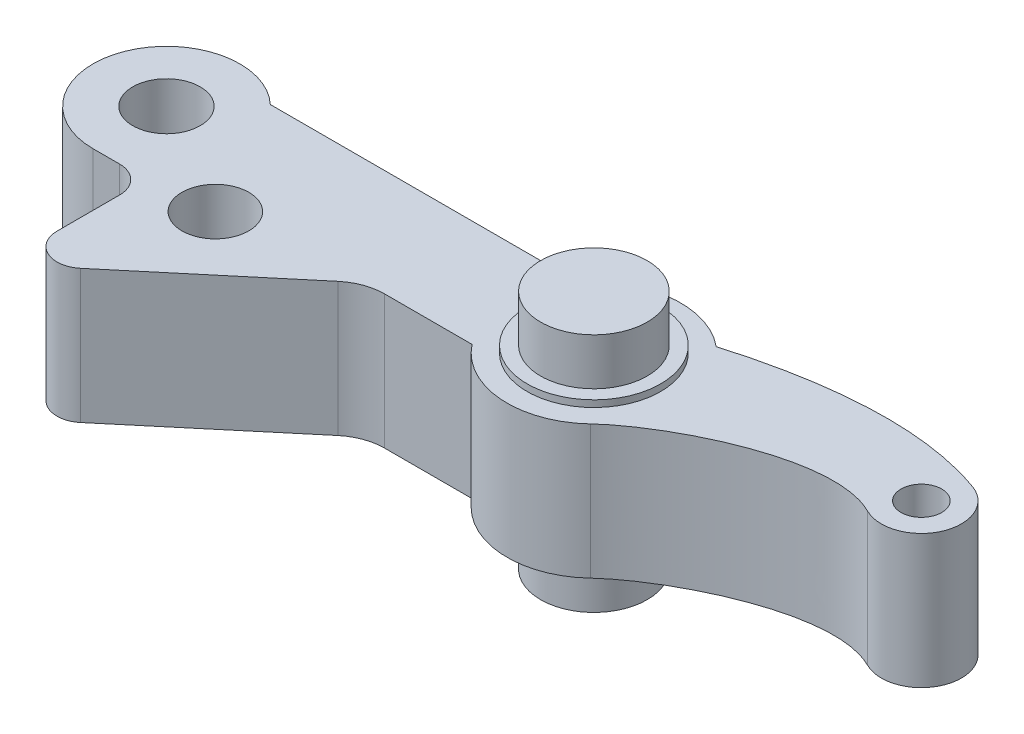
ISO-10303-21;
HEADER;
FILE_DESCRIPTION(('STEP AP214'),'2;1');
FILE_NAME('part.step','',(''),(''),'','','');
FILE_SCHEMA(('AUTOMOTIVE_DESIGN { 1 0 10303 214 1 1 1 1 }'));
ENDSEC;
DATA;
#1=APPLICATION_CONTEXT('core data for automotive mechanical design processes');
#2=APPLICATION_PROTOCOL_DEFINITION('international standard','automotive_design',2000,#1);
#3=PRODUCT_CONTEXT('',#1,'mechanical');
#4=PRODUCT('Part','Part','',(#3));
#5=PRODUCT_RELATED_PRODUCT_CATEGORY('part','',(#4));
#6=PRODUCT_DEFINITION_FORMATION('','',#4);
#7=PRODUCT_DEFINITION_CONTEXT('part definition',#1,'design');
#8=PRODUCT_DEFINITION('design','',#6,#7);
#9=PRODUCT_DEFINITION_SHAPE('','',#8);
#10=(LENGTH_UNIT() NAMED_UNIT(*) SI_UNIT(.MILLI.,.METRE.));
#11=(NAMED_UNIT(*) PLANE_ANGLE_UNIT() SI_UNIT($,.RADIAN.));
#12=(NAMED_UNIT(*) SI_UNIT($,.STERADIAN.) SOLID_ANGLE_UNIT());
#13=UNCERTAINTY_MEASURE_WITH_UNIT(LENGTH_MEASURE(1.E-05),#10,'distance_accuracy_value','');
#14=(GEOMETRIC_REPRESENTATION_CONTEXT(3) GLOBAL_UNCERTAINTY_ASSIGNED_CONTEXT((#13)) GLOBAL_UNIT_ASSIGNED_CONTEXT((#10,
#11,#12)) REPRESENTATION_CONTEXT('',''));
#15=CARTESIAN_POINT('',(0.,0.,0.));
#16=DIRECTION('',(0.,0.,1.));
#17=DIRECTION('',(1.,0.,0.));
#18=AXIS2_PLACEMENT_3D('',#15,#16,#17);
#19=CARTESIAN_POINT('',(0.,10.,0.));
#20=DIRECTION('',(0.,-1.,0.));
#21=DIRECTION('',(0.,0.,1.));
#22=AXIS2_PLACEMENT_3D('',#19,#20,#21);
#23=CYLINDRICAL_SURFACE('',#22,6.5);
#24=DIRECTION('',(0.,-1.,0.));
#25=VECTOR('',#24,1.);
#26=CARTESIAN_POINT('',(4.15942052119721,10.,-4.9949195116483));
#27=LINE('',#26,#25);
#28=CARTESIAN_POINT('',(4.15942052119714,10.,-4.99491951164822));
#29=VERTEX_POINT('',#28);
#30=CARTESIAN_POINT('',(4.15942052119714,0.,-4.99491951164822));
#31=VERTEX_POINT('',#30);
#32=EDGE_CURVE('E268',#29,#31,#27,.T.);
#33=ORIENTED_EDGE('',*,*,#32,.T.);
#34=CARTESIAN_POINT('',(0.,0.,0.));
#35=DIRECTION('',(0.,-1.,0.));
#36=DIRECTION('',(0.,0.,-1.));
#37=AXIS2_PLACEMENT_3D('',#34,#35,#36);
#38=CIRCLE('',#37,6.5);
#39=CARTESIAN_POINT('',(-5.1234753829798,0.,-4.));
#40=VERTEX_POINT('',#39);
#41=EDGE_CURVE('E271',#40,#31,#38,.T.);
#42=ORIENTED_EDGE('',*,*,#41,.F.);
#43=DIRECTION('',(0.,-1.,0.));
#44=VECTOR('',#43,1.);
#45=CARTESIAN_POINT('',(-5.1234753829798,10.,-4.));
#46=LINE('',#45,#44);
#47=CARTESIAN_POINT('',(-5.1234753829798,10.,-4.));
#48=VERTEX_POINT('',#47);
#49=EDGE_CURVE('E328',#48,#40,#46,.T.);
#50=ORIENTED_EDGE('',*,*,#49,.F.);
#51=CARTESIAN_POINT('',(0.,10.,0.));
#52=DIRECTION('',(0.,-1.,0.));
#53=DIRECTION('',(0.,0.,-1.));
#54=AXIS2_PLACEMENT_3D('',#51,#52,#53);
#55=CIRCLE('',#54,6.5);
#56=EDGE_CURVE('E273',#48,#29,#55,.T.);
#57=ORIENTED_EDGE('',*,*,#56,.T.);
#58=EDGE_LOOP('',(#33,#42,#50,#57));
#59=FACE_BOUND('',#58,.T.);
#60=ADVANCED_FACE('F49',(#59),#23,.T.);
#61=CARTESIAN_POINT('',(0.,10.,0.));
#62=DIRECTION('',(0.,1.,0.));
#63=DIRECTION('',(0.,0.,-1.));
#64=AXIS2_PLACEMENT_3D('',#61,#62,#63);
#65=PLANE('',#64);
#66=CARTESIAN_POINT('',(0.,10.,0.));
#67=DIRECTION('',(0.,-1.,0.));
#68=DIRECTION('',(0.,0.,-1.));
#69=AXIS2_PLACEMENT_3D('',#66,#67,#68);
#70=CIRCLE('',#69,5.);
#71=CARTESIAN_POINT('',(0.,10.,-5.));
#72=VERTEX_POINT('',#71);
#73=EDGE_CURVE('E409',#72,#72,#70,.T.);
#74=ORIENTED_EDGE('',*,*,#73,.T.);
#75=EDGE_LOOP('',(#74));
#76=FACE_BOUND('',#75,.T.);
#77=CARTESIAN_POINT('',(-32.,10.,0.));
#78=DIRECTION('',(0.,-1.,0.));
#79=DIRECTION('',(0.,0.,-1.));
#80=AXIS2_PLACEMENT_3D('',#77,#78,#79);
#81=CIRCLE('',#80,2.525);
#82=CARTESIAN_POINT('',(-32.,10.,-2.525));
#83=VERTEX_POINT('',#82);
#84=EDGE_CURVE('E297',#83,#83,#81,.T.);
#85=ORIENTED_EDGE('',*,*,#84,.T.);
#86=EDGE_LOOP('',(#85));
#87=FACE_BOUND('',#86,.T.);
#88=DIRECTION('',(-0.766044443118977,0.,0.64278760968654));
#89=VECTOR('',#88,1.);
#90=CARTESIAN_POINT('',(-13.1234753829798,10.,4.));
#91=LINE('',#90,#89);
#92=CARTESIAN_POINT('',(-14.2387448846612,10.,4.93582222752409));
#93=VERTEX_POINT('',#92);
#94=CARTESIAN_POINT('',(-24.7144247806269,10.,13.7259613645602));
#95=VERTEX_POINT('',#94);
#96=EDGE_CURVE('E310',#93,#95,#91,.T.);
#97=ORIENTED_EDGE('',*,*,#96,.F.);
#98=CARTESIAN_POINT('',(-11.667594445915,10.,8.));
#99=DIRECTION('',(0.,-1.,0.));
#100=DIRECTION('',(0.,0.,-1.));
#101=AXIS2_PLACEMENT_3D('',#98,#99,#100);
#102=CIRCLE('',#101,4.);
#103=CARTESIAN_POINT('',(-11.667594445915,10.,4.));
#104=VERTEX_POINT('',#103);
#105=EDGE_CURVE('E374',#104,#93,#102,.F.);
#106=ORIENTED_EDGE('',*,*,#105,.F.);
#107=DIRECTION('',(-1.,0.,0.));
#108=VECTOR('',#107,1.);
#109=CARTESIAN_POINT('',(-5.1234753829798,10.,4.));
#110=LINE('',#109,#108);
#111=CARTESIAN_POINT('',(-5.1234753829798,10.,4.));
#112=VERTEX_POINT('',#111);
#113=EDGE_CURVE('E306',#112,#104,#110,.T.);
#114=ORIENTED_EDGE('',*,*,#113,.F.);
#115=CARTESIAN_POINT('',(4.46665949633729,10.,4.72217671670385));
#116=VERTEX_POINT('',#115);
#117=EDGE_CURVE('E179',#116,#112,#55,.T.);
#118=ORIENTED_EDGE('',*,*,#117,.F.);
#119=CARTESIAN_POINT('',(4.46665949633744,10.,4.722176716704));
#120=CARTESIAN_POINT('',(7.28486409440791,10.,2.05646531160841));
#121=CARTESIAN_POINT('',(15.7167376008388,10.,-2.39624755191802));
#122=CARTESIAN_POINT('',(20.4900711475221,10.,0.));
#123=B_SPLINE_CURVE_WITH_KNOTS('',3,(#119,#120,#121,#122),.UNSPECIFIED.,.F.,.F.,(4,4),(0.,1.),.UNSPECIFIED.);
#124=CARTESIAN_POINT('',(20.4900711475221,10.,0.));
#125=VERTEX_POINT('',#124);
#126=EDGE_CURVE('E155',#116,#125,#123,.T.);
#127=ORIENTED_EDGE('',*,*,#126,.T.);
#128=CARTESIAN_POINT('',(21.8360153361091,10.,-2.68112555491325));
#129=DIRECTION('',(0.,1.,0.));
#130=DIRECTION('',(0.,0.,1.));
#131=AXIS2_PLACEMENT_3D('',#128,#129,#130);
#132=CIRCLE('',#131,3.);
#133=CARTESIAN_POINT('',(22.8496559981527,10.,-5.50469290991856));
#134=VERTEX_POINT('',#133);
#135=EDGE_CURVE('E167',#134,#125,#132,.F.);
#136=ORIENTED_EDGE('',*,*,#135,.F.);
#137=CARTESIAN_POINT('',(4.15942052119714,10.,-4.99491951164822));
#138=CARTESIAN_POINT('',(15.250954870233,10.,-8.23257274190577));
#139=CARTESIAN_POINT('',(22.8496559981527,10.,-5.50469290991856));
#140=B_SPLINE_CURVE_WITH_KNOTS('',2,(#137,#138,#139),.UNSPECIFIED.,.F.,.F.,(3,3),(0.,1.),.UNSPECIFIED.);
#141=EDGE_CURVE('E172',#29,#134,#140,.T.);
#142=ORIENTED_EDGE('',*,*,#141,.F.);
#143=ORIENTED_EDGE('',*,*,#56,.F.);
#144=DIRECTION('',(1.,0.,0.));
#145=VECTOR('',#144,1.);
#146=CARTESIAN_POINT('',(-5.1234753829798,10.,-4.));
#147=LINE('',#146,#145);
#148=CARTESIAN_POINT('',(-28.2250827823646,10.,-4.));
#149=VERTEX_POINT('',#148);
#150=EDGE_CURVE('E325',#149,#48,#147,.T.);
#151=ORIENTED_EDGE('',*,*,#150,.F.);
#152=CARTESIAN_POINT('',(-32.,10.,0.));
#153=DIRECTION('',(0.,-1.,0.));
#154=DIRECTION('',(0.,0.,-1.));
#155=AXIS2_PLACEMENT_3D('',#152,#153,#154);
#156=CIRCLE('',#155,5.5);
#157=CARTESIAN_POINT('',(-32.,10.,5.5));
#158=VERTEX_POINT('',#157);
#159=EDGE_CURVE('E321',#158,#149,#156,.T.);
#160=ORIENTED_EDGE('',*,*,#159,.F.);
#161=DIRECTION('',(-1.,0.,0.));
#162=VECTOR('',#161,1.);
#163=CARTESIAN_POINT('',(-32.,10.,5.5));
#164=LINE('',#163,#162);
#165=CARTESIAN_POINT('',(-30.,10.,5.5));
#166=VERTEX_POINT('',#165);
#167=EDGE_CURVE('E317',#166,#158,#164,.T.);
#168=ORIENTED_EDGE('',*,*,#167,.F.);
#169=CARTESIAN_POINT('',(-30.,10.,7.5));
#170=DIRECTION('',(0.,-1.,0.));
#171=DIRECTION('',(0.,0.,-1.));
#172=AXIS2_PLACEMENT_3D('',#169,#170,#171);
#173=CIRCLE('',#172,2.);
#174=CARTESIAN_POINT('',(-28.,10.,7.5));
#175=VERTEX_POINT('',#174);
#176=EDGE_CURVE('E11',#175,#166,#173,.F.);
#177=ORIENTED_EDGE('',*,*,#176,.F.);
#178=DIRECTION('',(0.,0.,-1.));
#179=VECTOR('',#178,1.);
#180=CARTESIAN_POINT('',(-28.,10.,16.4828863193414));
#181=LINE('',#180,#179);
#182=CARTESIAN_POINT('',(-28.,10.,12.1938724783223));
#183=VERTEX_POINT('',#182);
#184=EDGE_CURVE('E314',#183,#175,#181,.T.);
#185=ORIENTED_EDGE('',*,*,#184,.F.);
#186=CARTESIAN_POINT('',(-26.,10.,12.1938724783223));
#187=DIRECTION('',(0.,-1.,0.));
#188=DIRECTION('',(0.,0.,-1.));
#189=AXIS2_PLACEMENT_3D('',#186,#187,#188);
#190=CIRCLE('',#189,2.);
#191=EDGE_CURVE('E388',#95,#183,#190,.T.);
#192=ORIENTED_EDGE('',*,*,#191,.F.);
#193=EDGE_LOOP('',(#97,#106,#114,#118,#127,#136,#142,#143,#151,#160,#168,#177,#185,#192));
#194=FACE_BOUND('',#193,.T.);
#195=CARTESIAN_POINT('',(-23.3397459621556,10.,5.00000000000001));
#196=DIRECTION('',(0.,-1.,0.));
#197=DIRECTION('',(0.,0.,-1.));
#198=AXIS2_PLACEMENT_3D('',#195,#196,#197);
#199=CIRCLE('',#198,2.505);
#200=CARTESIAN_POINT('',(-23.3397459621556,10.,2.49500000000001));
#201=VERTEX_POINT('',#200);
#202=EDGE_CURVE('E282',#201,#201,#199,.T.);
#203=ORIENTED_EDGE('',*,*,#202,.T.);
#204=EDGE_LOOP('',(#203));
#205=FACE_BOUND('',#204,.T.);
#206=CARTESIAN_POINT('',(21.8360153361091,10.,-2.68112555491325));
#207=DIRECTION('',(0.,1.,0.));
#208=DIRECTION('',(0.,0.,1.));
#209=AXIS2_PLACEMENT_3D('',#206,#207,#208);
#210=CIRCLE('',#209,1.525);
#211=CARTESIAN_POINT('',(21.8360153361091,10.,-1.15612555491325));
#212=VERTEX_POINT('',#211);
#213=EDGE_CURVE('E181',#212,#212,#210,.F.);
#214=ORIENTED_EDGE('',*,*,#213,.T.);
#215=EDGE_LOOP('',(#214));
#216=FACE_BOUND('',#215,.T.);
#217=ADVANCED_FACE('F175',(#76,#87,#194,#205,#216),#65,.T.);
#218=CARTESIAN_POINT('',(0.,0.,0.));
#219=DIRECTION('',(0.,1.,0.));
#220=DIRECTION('',(0.,0.,-1.));
#221=AXIS2_PLACEMENT_3D('',#218,#219,#220);
#222=PLANE('',#221);
#223=CARTESIAN_POINT('',(0.,0.,0.));
#224=DIRECTION('',(0.,-1.,0.));
#225=DIRECTION('',(0.,0.,-1.));
#226=AXIS2_PLACEMENT_3D('',#223,#224,#225);
#227=CIRCLE('',#226,5.);
#228=CARTESIAN_POINT('',(0.,0.,-5.));
#229=VERTEX_POINT('',#228);
#230=EDGE_CURVE('E418',#229,#229,#227,.T.);
#231=ORIENTED_EDGE('',*,*,#230,.F.);
#232=EDGE_LOOP('',(#231));
#233=FACE_BOUND('',#232,.T.);
#234=DIRECTION('',(0.,0.,-1.));
#235=VECTOR('',#234,1.);
#236=CARTESIAN_POINT('',(-28.,0.,16.4828863193414));
#237=LINE('',#236,#235);
#238=CARTESIAN_POINT('',(-28.,0.,12.1938724783223));
#239=VERTEX_POINT('',#238);
#240=CARTESIAN_POINT('',(-28.,0.,7.5));
#241=VERTEX_POINT('',#240);
#242=EDGE_CURVE('E339',#239,#241,#237,.T.);
#243=ORIENTED_EDGE('',*,*,#242,.T.);
#244=CARTESIAN_POINT('',(-30.,0.,7.5));
#245=DIRECTION('',(0.,-1.,0.));
#246=DIRECTION('',(0.,0.,-1.));
#247=AXIS2_PLACEMENT_3D('',#244,#245,#246);
#248=CIRCLE('',#247,2.);
#249=CARTESIAN_POINT('',(-30.,0.,5.5));
#250=VERTEX_POINT('',#249);
#251=EDGE_CURVE('E59',#250,#241,#248,.T.);
#252=ORIENTED_EDGE('',*,*,#251,.F.);
#253=DIRECTION('',(-1.,0.,0.));
#254=VECTOR('',#253,1.);
#255=CARTESIAN_POINT('',(-32.,0.,5.5));
#256=LINE('',#255,#254);
#257=CARTESIAN_POINT('',(-32.,0.,5.5));
#258=VERTEX_POINT('',#257);
#259=EDGE_CURVE('E343',#250,#258,#256,.T.);
#260=ORIENTED_EDGE('',*,*,#259,.T.);
#261=CARTESIAN_POINT('',(-32.,0.,0.));
#262=DIRECTION('',(0.,-1.,0.));
#263=DIRECTION('',(0.,0.,-1.));
#264=AXIS2_PLACEMENT_3D('',#261,#262,#263);
#265=CIRCLE('',#264,5.5);
#266=CARTESIAN_POINT('',(-28.2250827823646,0.,-4.));
#267=VERTEX_POINT('',#266);
#268=EDGE_CURVE('E347',#258,#267,#265,.T.);
#269=ORIENTED_EDGE('',*,*,#268,.T.);
#270=DIRECTION('',(1.,0.,0.));
#271=VECTOR('',#270,1.);
#272=CARTESIAN_POINT('',(-5.1234753829798,0.,-4.));
#273=LINE('',#272,#271);
#274=EDGE_CURVE('E350',#267,#40,#273,.T.);
#275=ORIENTED_EDGE('',*,*,#274,.T.);
#276=ORIENTED_EDGE('',*,*,#41,.T.);
#277=CARTESIAN_POINT('',(4.15942052119714,0.,-4.99491951164822));
#278=CARTESIAN_POINT('',(15.250954870233,0.,-8.23257274190577));
#279=CARTESIAN_POINT('',(22.8496559981527,0.,-5.50469290991856));
#280=B_SPLINE_CURVE_WITH_KNOTS('',2,(#277,#278,#279),.UNSPECIFIED.,.F.,.F.,(3,3),(0.,1.),.UNSPECIFIED.);
#281=CARTESIAN_POINT('',(22.8496559981527,0.,-5.50469290991856));
#282=VERTEX_POINT('',#281);
#283=EDGE_CURVE('E187',#31,#282,#280,.T.);
#284=ORIENTED_EDGE('',*,*,#283,.T.);
#285=CARTESIAN_POINT('',(21.8360153361091,0.,-2.68112555491325));
#286=DIRECTION('',(0.,1.,0.));
#287=DIRECTION('',(0.,0.,1.));
#288=AXIS2_PLACEMENT_3D('',#285,#286,#287);
#289=CIRCLE('',#288,3.);
#290=CARTESIAN_POINT('',(20.4900711475221,0.,0.));
#291=VERTEX_POINT('',#290);
#292=EDGE_CURVE('E432',#282,#291,#289,.F.);
#293=ORIENTED_EDGE('',*,*,#292,.T.);
#294=CARTESIAN_POINT('',(4.46665949633744,0.,4.722176716704));
#295=CARTESIAN_POINT('',(7.28486409440791,0.,2.05646531160841));
#296=CARTESIAN_POINT('',(15.7167376008388,0.,-2.39624755191802));
#297=CARTESIAN_POINT('',(20.4900711475221,0.,0.));
#298=B_SPLINE_CURVE_WITH_KNOTS('',3,(#294,#295,#296,#297),.UNSPECIFIED.,.F.,.F.,(4,4),(0.,1.),.UNSPECIFIED.);
#299=CARTESIAN_POINT('',(4.46665949633736,0.,4.72217671670392));
#300=VERTEX_POINT('',#299);
#301=EDGE_CURVE('E158',#300,#291,#298,.T.);
#302=ORIENTED_EDGE('',*,*,#301,.F.);
#303=CARTESIAN_POINT('',(-5.1234753829798,0.,4.));
#304=VERTEX_POINT('',#303);
#305=EDGE_CURVE('E301',#300,#304,#38,.T.);
#306=ORIENTED_EDGE('',*,*,#305,.T.);
#307=DIRECTION('',(-1.,0.,0.));
#308=VECTOR('',#307,1.);
#309=CARTESIAN_POINT('',(-5.1234753829798,0.,4.));
#310=LINE('',#309,#308);
#311=CARTESIAN_POINT('',(-11.667594445915,0.,4.));
#312=VERTEX_POINT('',#311);
#313=EDGE_CURVE('E331',#304,#312,#310,.T.);
#314=ORIENTED_EDGE('',*,*,#313,.T.);
#315=CARTESIAN_POINT('',(-11.667594445915,0.,8.));
#316=DIRECTION('',(0.,-1.,0.));
#317=DIRECTION('',(0.,0.,-1.));
#318=AXIS2_PLACEMENT_3D('',#315,#316,#317);
#319=CIRCLE('',#318,4.);
#320=CARTESIAN_POINT('',(-14.2387448846612,0.,4.93582222752409));
#321=VERTEX_POINT('',#320);
#322=EDGE_CURVE('E370',#321,#312,#319,.T.);
#323=ORIENTED_EDGE('',*,*,#322,.F.);
#324=DIRECTION('',(-0.766044443118977,0.,0.64278760968654));
#325=VECTOR('',#324,1.);
#326=CARTESIAN_POINT('',(-13.1234753829798,0.,4.));
#327=LINE('',#326,#325);
#328=CARTESIAN_POINT('',(-24.7144247806269,0.,13.7259613645602));
#329=VERTEX_POINT('',#328);
#330=EDGE_CURVE('E335',#321,#329,#327,.T.);
#331=ORIENTED_EDGE('',*,*,#330,.T.);
#332=CARTESIAN_POINT('',(-26.,0.,12.1938724783223));
#333=DIRECTION('',(0.,-1.,0.));
#334=DIRECTION('',(0.,0.,-1.));
#335=AXIS2_PLACEMENT_3D('',#332,#333,#334);
#336=CIRCLE('',#335,2.);
#337=EDGE_CURVE('E381',#239,#329,#336,.F.);
#338=ORIENTED_EDGE('',*,*,#337,.F.);
#339=EDGE_LOOP('',(#243,#252,#260,#269,#275,#276,#284,#293,#302,#306,#314,#323,#331,#338));
#340=FACE_BOUND('',#339,.T.);
#341=CARTESIAN_POINT('',(-32.,0.,0.));
#342=DIRECTION('',(0.,-1.,0.));
#343=DIRECTION('',(0.,0.,-1.));
#344=AXIS2_PLACEMENT_3D('',#341,#342,#343);
#345=CIRCLE('',#344,2.525);
#346=CARTESIAN_POINT('',(-32.,0.,-2.525));
#347=VERTEX_POINT('',#346);
#348=EDGE_CURVE('E295',#347,#347,#345,.T.);
#349=ORIENTED_EDGE('',*,*,#348,.F.);
#350=EDGE_LOOP('',(#349));
#351=FACE_BOUND('',#350,.T.);
#352=CARTESIAN_POINT('',(-23.3397459621556,0.,5.00000000000001));
#353=DIRECTION('',(0.,-1.,0.));
#354=DIRECTION('',(0.,0.,-1.));
#355=AXIS2_PLACEMENT_3D('',#352,#353,#354);
#356=CIRCLE('',#355,2.505);
#357=CARTESIAN_POINT('',(-23.3397459621556,0.,2.49500000000001));
#358=VERTEX_POINT('',#357);
#359=EDGE_CURVE('E276',#358,#358,#356,.T.);
#360=ORIENTED_EDGE('',*,*,#359,.F.);
#361=EDGE_LOOP('',(#360));
#362=FACE_BOUND('',#361,.T.);
#363=CARTESIAN_POINT('',(21.8360153361091,0.,-2.68112555491325));
#364=DIRECTION('',(0.,1.,0.));
#365=DIRECTION('',(0.,0.,1.));
#366=AXIS2_PLACEMENT_3D('',#363,#364,#365);
#367=CIRCLE('',#366,1.525);
#368=CARTESIAN_POINT('',(21.8360153361091,0.,-1.15612555491325));
#369=VERTEX_POINT('',#368);
#370=EDGE_CURVE('E423',#369,#369,#367,.F.);
#371=ORIENTED_EDGE('',*,*,#370,.F.);
#372=EDGE_LOOP('',(#371));
#373=FACE_BOUND('',#372,.T.);
#374=ADVANCED_FACE('F219',(#233,#340,#351,#362,#373),#222,.F.);
#375=ORIENTED_EDGE('',*,*,#117,.T.);
#376=DIRECTION('',(0.,-1.,0.));
#377=VECTOR('',#376,1.);
#378=CARTESIAN_POINT('',(-5.1234753829798,10.,4.));
#379=LINE('',#378,#377);
#380=EDGE_CURVE('E361',#112,#304,#379,.T.);
#381=ORIENTED_EDGE('',*,*,#380,.T.);
#382=ORIENTED_EDGE('',*,*,#305,.F.);
#383=DIRECTION('',(0.,-1.,0.));
#384=VECTOR('',#383,1.);
#385=CARTESIAN_POINT('',(4.46665949633736,10.,4.72217671670392));
#386=LINE('',#385,#384);
#387=EDGE_CURVE('E164',#116,#300,#386,.T.);
#388=ORIENTED_EDGE('',*,*,#387,.F.);
#389=EDGE_LOOP('',(#375,#381,#382,#388));
#390=FACE_BOUND('',#389,.T.);
#391=ADVANCED_FACE('F223',(#390),#23,.T.);
#392=CARTESIAN_POINT('',(-5.1234753829798,10.,4.));
#393=DIRECTION('',(0.,0.,-1.));
#394=DIRECTION('',(1.,0.,0.));
#395=AXIS2_PLACEMENT_3D('',#392,#393,#394);
#396=PLANE('',#395);
#397=ORIENTED_EDGE('',*,*,#313,.F.);
#398=ORIENTED_EDGE('',*,*,#380,.F.);
#399=ORIENTED_EDGE('',*,*,#113,.T.);
#400=DIRECTION('',(0.,-1.,0.));
#401=VECTOR('',#400,1.);
#402=CARTESIAN_POINT('',(-11.667594445915,10.,4.));
#403=LINE('',#402,#401);
#404=EDGE_CURVE('E367',#312,#104,#403,.F.);
#405=ORIENTED_EDGE('',*,*,#404,.F.);
#406=EDGE_LOOP('',(#397,#398,#399,#405));
#407=FACE_BOUND('',#406,.T.);
#408=ADVANCED_FACE('F242',(#407),#396,.F.);
#409=CARTESIAN_POINT('',(-13.1234753829798,10.,4.));
#410=DIRECTION('',(-0.64278760968654,0.,-0.766044443118977));
#411=DIRECTION('',(0.766044443118977,0.,-0.64278760968654));
#412=AXIS2_PLACEMENT_3D('',#409,#410,#411);
#413=PLANE('',#412);
#414=ORIENTED_EDGE('',*,*,#330,.F.);
#415=DIRECTION('',(0.,-1.,0.));
#416=VECTOR('',#415,1.);
#417=CARTESIAN_POINT('',(-14.2387448846612,0.,4.93582222752409));
#418=LINE('',#417,#416);
#419=EDGE_CURVE('E364',#93,#321,#418,.T.);
#420=ORIENTED_EDGE('',*,*,#419,.F.);
#421=ORIENTED_EDGE('',*,*,#96,.T.);
#422=DIRECTION('',(0.,-1.,0.));
#423=VECTOR('',#422,1.);
#424=CARTESIAN_POINT('',(-24.7144247806269,10.,13.7259613645602));
#425=LINE('',#424,#423);
#426=EDGE_CURVE('E385',#329,#95,#425,.F.);
#427=ORIENTED_EDGE('',*,*,#426,.F.);
#428=EDGE_LOOP('',(#414,#420,#421,#427));
#429=FACE_BOUND('',#428,.T.);
#430=ADVANCED_FACE('F239',(#429),#413,.F.);
#431=CARTESIAN_POINT('',(-28.,10.,16.4828863193414));
#432=DIRECTION('',(1.,0.,0.));
#433=DIRECTION('',(0.,0.,1.));
#434=AXIS2_PLACEMENT_3D('',#431,#432,#433);
#435=PLANE('',#434);
#436=ORIENTED_EDGE('',*,*,#242,.F.);
#437=DIRECTION('',(0.,-1.,0.));
#438=VECTOR('',#437,1.);
#439=CARTESIAN_POINT('',(-28.,10.,12.1938724783223));
#440=LINE('',#439,#438);
#441=EDGE_CURVE('E378',#183,#239,#440,.T.);
#442=ORIENTED_EDGE('',*,*,#441,.F.);
#443=ORIENTED_EDGE('',*,*,#184,.T.);
#444=DIRECTION('',(0.,-1.,0.));
#445=VECTOR('',#444,1.);
#446=CARTESIAN_POINT('',(-28.,10.,7.5));
#447=LINE('',#446,#445);
#448=EDGE_CURVE('E67',#241,#175,#447,.F.);
#449=ORIENTED_EDGE('',*,*,#448,.F.);
#450=EDGE_LOOP('',(#436,#442,#443,#449));
#451=FACE_BOUND('',#450,.T.);
#452=ADVANCED_FACE('F235',(#451),#435,.F.);
#453=CARTESIAN_POINT('',(-32.,10.,5.5));
#454=DIRECTION('',(0.,0.,-1.));
#455=DIRECTION('',(1.,0.,0.));
#456=AXIS2_PLACEMENT_3D('',#453,#454,#455);
#457=PLANE('',#456);
#458=ORIENTED_EDGE('',*,*,#167,.T.);
#459=DIRECTION('',(0.,-1.,0.));
#460=VECTOR('',#459,1.);
#461=CARTESIAN_POINT('',(-32.,10.,5.5));
#462=LINE('',#461,#460);
#463=EDGE_CURVE('E358',#158,#258,#462,.T.);
#464=ORIENTED_EDGE('',*,*,#463,.T.);
#465=ORIENTED_EDGE('',*,*,#259,.F.);
#466=DIRECTION('',(0.,-1.,0.));
#467=VECTOR('',#466,1.);
#468=CARTESIAN_POINT('',(-30.,0.,5.5));
#469=LINE('',#468,#467);
#470=EDGE_CURVE('E391',#166,#250,#469,.T.);
#471=ORIENTED_EDGE('',*,*,#470,.F.);
#472=EDGE_LOOP('',(#458,#464,#465,#471));
#473=FACE_BOUND('',#472,.T.);
#474=ADVANCED_FACE('F231',(#473),#457,.F.);
#475=CARTESIAN_POINT('',(-32.,10.,0.));
#476=DIRECTION('',(0.,-1.,0.));
#477=DIRECTION('',(0.,0.,1.));
#478=AXIS2_PLACEMENT_3D('',#475,#476,#477);
#479=CYLINDRICAL_SURFACE('',#478,5.5);
#480=ORIENTED_EDGE('',*,*,#268,.F.);
#481=ORIENTED_EDGE('',*,*,#463,.F.);
#482=ORIENTED_EDGE('',*,*,#159,.T.);
#483=DIRECTION('',(0.,-1.,0.));
#484=VECTOR('',#483,1.);
#485=CARTESIAN_POINT('',(-28.2250827823646,10.,-4.));
#486=LINE('',#485,#484);
#487=EDGE_CURVE('E355',#149,#267,#486,.T.);
#488=ORIENTED_EDGE('',*,*,#487,.T.);
#489=EDGE_LOOP('',(#480,#481,#482,#488));
#490=FACE_BOUND('',#489,.T.);
#491=ADVANCED_FACE('F227',(#490),#479,.T.);
#492=CARTESIAN_POINT('',(-5.1234753829798,10.,-4.));
#493=DIRECTION('',(0.,0.,1.));
#494=DIRECTION('',(-1.,0.,0.));
#495=AXIS2_PLACEMENT_3D('',#492,#493,#494);
#496=PLANE('',#495);
#497=ORIENTED_EDGE('',*,*,#274,.F.);
#498=ORIENTED_EDGE('',*,*,#487,.F.);
#499=ORIENTED_EDGE('',*,*,#150,.T.);
#500=ORIENTED_EDGE('',*,*,#49,.T.);
#501=EDGE_LOOP('',(#497,#498,#499,#500));
#502=FACE_BOUND('',#501,.T.);
#503=ADVANCED_FACE('F215',(#502),#496,.F.);
#504=CARTESIAN_POINT('',(-32.,10.,0.));
#505=DIRECTION('',(0.,-1.,0.));
#506=DIRECTION('',(0.,0.,1.));
#507=AXIS2_PLACEMENT_3D('',#504,#505,#506);
#508=CYLINDRICAL_SURFACE('',#507,2.525);
#509=ORIENTED_EDGE('',*,*,#84,.F.);
#510=EDGE_LOOP('',(#509));
#511=FACE_BOUND('',#510,.T.);
#512=ORIENTED_EDGE('',*,*,#348,.T.);
#513=EDGE_LOOP('',(#512));
#514=FACE_BOUND('',#513,.T.);
#515=ADVANCED_FACE('F211',(#511,#514),#508,.F.);
#516=CARTESIAN_POINT('',(-23.3397459621556,10.,5.00000000000001));
#517=DIRECTION('',(0.,-1.,0.));
#518=DIRECTION('',(0.,0.,1.));
#519=AXIS2_PLACEMENT_3D('',#516,#517,#518);
#520=CYLINDRICAL_SURFACE('',#519,2.505);
#521=ORIENTED_EDGE('',*,*,#202,.F.);
#522=EDGE_LOOP('',(#521));
#523=FACE_BOUND('',#522,.T.);
#524=ORIENTED_EDGE('',*,*,#359,.T.);
#525=EDGE_LOOP('',(#524));
#526=FACE_BOUND('',#525,.T.);
#527=ADVANCED_FACE('F207',(#523,#526),#520,.F.);
#528=DIRECTION('',(0.,-1.,0.));
#529=VECTOR('',#528,1.);
#530=SURFACE_OF_LINEAR_EXTRUSION('',#140,#529);
#531=ORIENTED_EDGE('',*,*,#283,.F.);
#532=ORIENTED_EDGE('',*,*,#32,.F.);
#533=ORIENTED_EDGE('',*,*,#141,.T.);
#534=DIRECTION('',(0.,-1.,0.));
#535=VECTOR('',#534,1.);
#536=CARTESIAN_POINT('',(22.8496559981527,10.,-5.50469290991856));
#537=LINE('',#536,#535);
#538=EDGE_CURVE('E163',#134,#282,#537,.T.);
#539=ORIENTED_EDGE('',*,*,#538,.T.);
#540=EDGE_LOOP('',(#531,#532,#533,#539));
#541=FACE_BOUND('',#540,.T.);
#542=ADVANCED_FACE('F210',(#541),#530,.T.);
#543=CARTESIAN_POINT('',(21.8360153361091,10.,-2.68112555491325));
#544=DIRECTION('',(0.,-1.,0.));
#545=DIRECTION('',(0.,0.,1.));
#546=AXIS2_PLACEMENT_3D('',#543,#544,#545);
#547=CYLINDRICAL_SURFACE('',#546,3.);
#548=ORIENTED_EDGE('',*,*,#292,.F.);
#549=ORIENTED_EDGE('',*,*,#538,.F.);
#550=ORIENTED_EDGE('',*,*,#135,.T.);
#551=DIRECTION('',(0.,-1.,0.));
#552=VECTOR('',#551,1.);
#553=CARTESIAN_POINT('',(20.4900711475221,10.,0.));
#554=LINE('',#553,#552);
#555=EDGE_CURVE('E151',#125,#291,#554,.T.);
#556=ORIENTED_EDGE('',*,*,#555,.T.);
#557=EDGE_LOOP('',(#548,#549,#550,#556));
#558=FACE_BOUND('',#557,.T.);
#559=ADVANCED_FACE('F168',(#558),#547,.T.);
#560=CARTESIAN_POINT('',(21.8360153361091,10.,-2.68112555491325));
#561=DIRECTION('',(0.,-1.,0.));
#562=DIRECTION('',(0.,0.,1.));
#563=AXIS2_PLACEMENT_3D('',#560,#561,#562);
#564=CYLINDRICAL_SURFACE('',#563,1.525);
#565=ORIENTED_EDGE('',*,*,#213,.F.);
#566=EDGE_LOOP('',(#565));
#567=FACE_BOUND('',#566,.T.);
#568=ORIENTED_EDGE('',*,*,#370,.T.);
#569=EDGE_LOOP('',(#568));
#570=FACE_BOUND('',#569,.T.);
#571=ADVANCED_FACE('F202',(#567,#570),#564,.F.);
#572=DIRECTION('',(0.,-1.,0.));
#573=VECTOR('',#572,1.);
#574=SURFACE_OF_LINEAR_EXTRUSION('',#123,#573);
#575=ORIENTED_EDGE('',*,*,#301,.T.);
#576=ORIENTED_EDGE('',*,*,#555,.F.);
#577=ORIENTED_EDGE('',*,*,#126,.F.);
#578=ORIENTED_EDGE('',*,*,#387,.T.);
#579=EDGE_LOOP('',(#575,#576,#577,#578));
#580=FACE_BOUND('',#579,.T.);
#581=ADVANCED_FACE('F153',(#580),#574,.F.);
#582=CARTESIAN_POINT('',(-11.667594445915,10.,8.));
#583=DIRECTION('',(0.,1.,0.));
#584=DIRECTION('',(0.,0.,-1.));
#585=AXIS2_PLACEMENT_3D('',#582,#583,#584);
#586=CYLINDRICAL_SURFACE('',#585,4.);
#587=ORIENTED_EDGE('',*,*,#105,.T.);
#588=ORIENTED_EDGE('',*,*,#419,.T.);
#589=ORIENTED_EDGE('',*,*,#322,.T.);
#590=ORIENTED_EDGE('',*,*,#404,.T.);
#591=EDGE_LOOP('',(#587,#588,#589,#590));
#592=FACE_BOUND('',#591,.T.);
#593=ADVANCED_FACE('F201',(#592),#586,.F.);
#594=CARTESIAN_POINT('',(-26.,10.,12.1938724783223));
#595=DIRECTION('',(0.,-1.,0.));
#596=DIRECTION('',(0.,0.,1.));
#597=AXIS2_PLACEMENT_3D('',#594,#595,#596);
#598=CYLINDRICAL_SURFACE('',#597,2.);
#599=ORIENTED_EDGE('',*,*,#191,.T.);
#600=ORIENTED_EDGE('',*,*,#441,.T.);
#601=ORIENTED_EDGE('',*,*,#337,.T.);
#602=ORIENTED_EDGE('',*,*,#426,.T.);
#603=EDGE_LOOP('',(#599,#600,#601,#602));
#604=FACE_BOUND('',#603,.T.);
#605=ADVANCED_FACE('F251',(#604),#598,.T.);
#606=CARTESIAN_POINT('',(-30.,10.,7.5));
#607=DIRECTION('',(0.,1.,0.));
#608=DIRECTION('',(0.,0.,-1.));
#609=AXIS2_PLACEMENT_3D('',#606,#607,#608);
#610=CYLINDRICAL_SURFACE('',#609,2.);
#611=ORIENTED_EDGE('',*,*,#176,.T.);
#612=ORIENTED_EDGE('',*,*,#470,.T.);
#613=ORIENTED_EDGE('',*,*,#251,.T.);
#614=ORIENTED_EDGE('',*,*,#448,.T.);
#615=EDGE_LOOP('',(#611,#612,#613,#614));
#616=FACE_BOUND('',#615,.T.);
#617=ADVANCED_FACE('F51',(#616),#610,.F.);
#618=CARTESIAN_POINT('',(0.,10.5,0.));
#619=DIRECTION('',(0.,-1.,0.));
#620=DIRECTION('',(0.,0.,1.));
#621=AXIS2_PLACEMENT_3D('',#618,#619,#620);
#622=CYLINDRICAL_SURFACE('',#621,5.);
#623=CARTESIAN_POINT('',(0.,10.5,0.));
#624=DIRECTION('',(0.,-1.,0.));
#625=DIRECTION('',(0.,0.,-1.));
#626=AXIS2_PLACEMENT_3D('',#623,#624,#625);
#627=CIRCLE('',#626,5.);
#628=CARTESIAN_POINT('',(0.,10.5,-5.));
#629=VERTEX_POINT('',#628);
#630=EDGE_CURVE('E401',#629,#629,#627,.T.);
#631=ORIENTED_EDGE('',*,*,#630,.T.);
#632=EDGE_LOOP('',(#631));
#633=FACE_BOUND('',#632,.T.);
#634=ORIENTED_EDGE('',*,*,#73,.F.);
#635=EDGE_LOOP('',(#634));
#636=FACE_BOUND('',#635,.T.);
#637=ADVANCED_FACE('F258',(#633,#636),#622,.T.);
#638=CARTESIAN_POINT('',(0.,10.5,0.));
#639=DIRECTION('',(0.,1.,0.));
#640=DIRECTION('',(0.,0.,-1.));
#641=AXIS2_PLACEMENT_3D('',#638,#639,#640);
#642=PLANE('',#641);
#643=CARTESIAN_POINT('',(0.,10.5,0.));
#644=DIRECTION('',(0.,-1.,0.));
#645=DIRECTION('',(0.,0.,-1.));
#646=AXIS2_PLACEMENT_3D('',#643,#644,#645);
#647=CIRCLE('',#646,3.99);
#648=CARTESIAN_POINT('',(0.,10.5,-3.99));
#649=VERTEX_POINT('',#648);
#650=EDGE_CURVE('E397',#649,#649,#647,.T.);
#651=ORIENTED_EDGE('',*,*,#650,.T.);
#652=EDGE_LOOP('',(#651));
#653=FACE_BOUND('',#652,.T.);
#654=ORIENTED_EDGE('',*,*,#630,.F.);
#655=EDGE_LOOP('',(#654));
#656=FACE_BOUND('',#655,.T.);
#657=ADVANCED_FACE('F493',(#653,#656),#642,.T.);
#658=CARTESIAN_POINT('',(0.,14.,0.));
#659=DIRECTION('',(0.,1.,0.));
#660=DIRECTION('',(0.,0.,-1.));
#661=AXIS2_PLACEMENT_3D('',#658,#659,#660);
#662=PLANE('',#661);
#663=CARTESIAN_POINT('',(0.,14.,0.));
#664=DIRECTION('',(0.,-1.,0.));
#665=DIRECTION('',(0.,0.,-1.));
#666=AXIS2_PLACEMENT_3D('',#663,#664,#665);
#667=CIRCLE('',#666,3.99);
#668=CARTESIAN_POINT('',(0.,14.,-3.99));
#669=VERTEX_POINT('',#668);
#670=EDGE_CURVE('E406',#669,#669,#667,.T.);
#671=ORIENTED_EDGE('',*,*,#670,.F.);
#672=EDGE_LOOP('',(#671));
#673=FACE_BOUND('',#672,.T.);
#674=ADVANCED_FACE('F488',(#673),#662,.T.);
#675=CARTESIAN_POINT('',(0.,14.,0.));
#676=DIRECTION('',(0.,-1.,0.));
#677=DIRECTION('',(0.,0.,1.));
#678=AXIS2_PLACEMENT_3D('',#675,#676,#677);
#679=CYLINDRICAL_SURFACE('',#678,3.99);
#680=ORIENTED_EDGE('',*,*,#650,.F.);
#681=EDGE_LOOP('',(#680));
#682=FACE_BOUND('',#681,.T.);
#683=ORIENTED_EDGE('',*,*,#670,.T.);
#684=EDGE_LOOP('',(#683));
#685=FACE_BOUND('',#684,.T.);
#686=ADVANCED_FACE('F478',(#682,#685),#679,.T.);
#687=CARTESIAN_POINT('',(0.,-0.5,0.));
#688=DIRECTION('',(0.,1.,0.));
#689=DIRECTION('',(0.,0.,-1.));
#690=AXIS2_PLACEMENT_3D('',#687,#688,#689);
#691=CYLINDRICAL_SURFACE('',#690,5.);
#692=CARTESIAN_POINT('',(0.,-0.5,0.));
#693=DIRECTION('',(0.,-1.,0.));
#694=DIRECTION('',(0.,0.,-1.));
#695=AXIS2_PLACEMENT_3D('',#692,#693,#694);
#696=CIRCLE('',#695,5.);
#697=CARTESIAN_POINT('',(0.,-0.5,-5.));
#698=VERTEX_POINT('',#697);
#699=EDGE_CURVE('E466',#698,#698,#696,.T.);
#700=ORIENTED_EDGE('',*,*,#699,.F.);
#701=EDGE_LOOP('',(#700));
#702=FACE_BOUND('',#701,.T.);
#703=ORIENTED_EDGE('',*,*,#230,.T.);
#704=EDGE_LOOP('',(#703));
#705=FACE_BOUND('',#704,.T.);
#706=ADVANCED_FACE('F475',(#702,#705),#691,.T.);
#707=CARTESIAN_POINT('',(0.,-0.5,0.));
#708=DIRECTION('',(0.,-1.,0.));
#709=DIRECTION('',(0.,0.,-1.));
#710=AXIS2_PLACEMENT_3D('',#707,#708,#709);
#711=PLANE('',#710);
#712=CARTESIAN_POINT('',(0.,-0.5,0.));
#713=DIRECTION('',(0.,1.,0.));
#714=DIRECTION('',(0.,0.,1.));
#715=AXIS2_PLACEMENT_3D('',#712,#713,#714);
#716=CIRCLE('',#715,3.99);
#717=CARTESIAN_POINT('',(0.,-0.5,3.99));
#718=VERTEX_POINT('',#717);
#719=EDGE_CURVE('E53',#718,#718,#716,.T.);
#720=ORIENTED_EDGE('',*,*,#719,.T.);
#721=EDGE_LOOP('',(#720));
#722=FACE_BOUND('',#721,.T.);
#723=ORIENTED_EDGE('',*,*,#699,.T.);
#724=EDGE_LOOP('',(#723));
#725=FACE_BOUND('',#724,.T.);
#726=ADVANCED_FACE('F477',(#722,#725),#711,.T.);
#727=CARTESIAN_POINT('',(0.,-4.,0.));
#728=DIRECTION('',(0.,1.,0.));
#729=DIRECTION('',(0.,0.,-1.));
#730=AXIS2_PLACEMENT_3D('',#727,#728,#729);
#731=PLANE('',#730);
#732=CARTESIAN_POINT('',(0.,-4.,0.));
#733=DIRECTION('',(0.,-1.,0.));
#734=DIRECTION('',(0.,0.,-1.));
#735=AXIS2_PLACEMENT_3D('',#732,#733,#734);
#736=CIRCLE('',#735,3.99);
#737=CARTESIAN_POINT('',(0.,-4.,-3.99));
#738=VERTEX_POINT('',#737);
#739=EDGE_CURVE('E400',#738,#738,#736,.T.);
#740=ORIENTED_EDGE('',*,*,#739,.T.);
#741=EDGE_LOOP('',(#740));
#742=FACE_BOUND('',#741,.T.);
#743=ADVANCED_FACE('F485',(#742),#731,.F.);
#744=ORIENTED_EDGE('',*,*,#719,.F.);
#745=EDGE_LOOP('',(#744));
#746=FACE_BOUND('',#745,.T.);
#747=ORIENTED_EDGE('',*,*,#739,.F.);
#748=EDGE_LOOP('',(#747));
#749=FACE_BOUND('',#748,.T.);
#750=ADVANCED_FACE('F491',(#746,#749),#679,.T.);
#751=CLOSED_SHELL('',(#60,#217,#374,#391,#408,#430,#452,#474,#491,#503,#515,#527,#542,#559,#571,
#581,#593,#605,#617,#637,#657,#674,#686,#706,#726,#743,#750));
#752=MANIFOLD_SOLID_BREP('B2',#751);
#753=ADVANCED_BREP_SHAPE_REPRESENTATION('',(#18,#752),#14);
#754=SHAPE_DEFINITION_REPRESENTATION(#9,#753);
ENDSEC;
END-ISO-10303-21;
